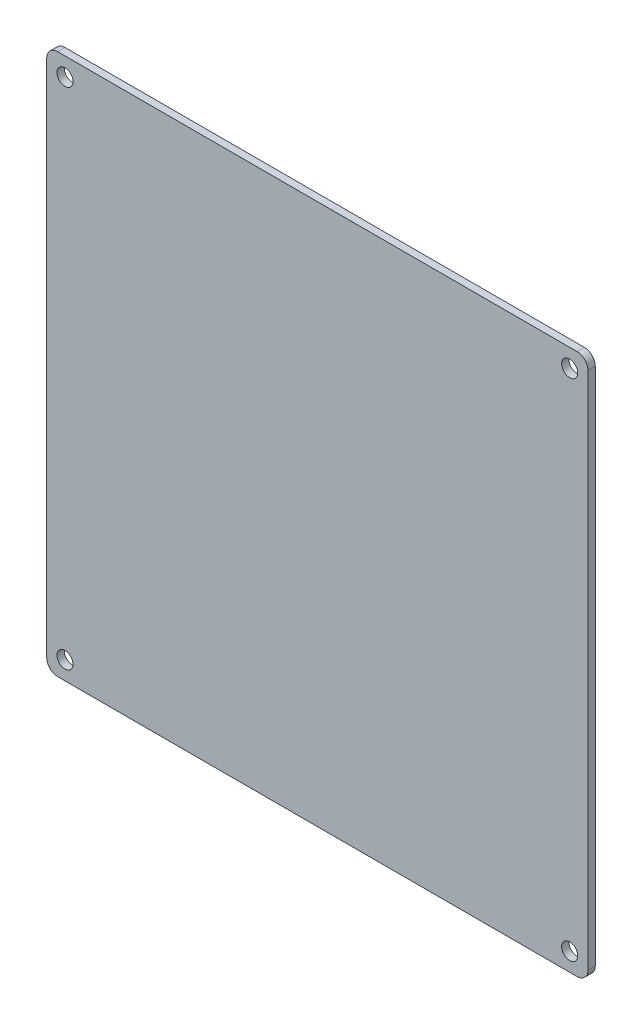
ISO-10303-21;
HEADER;
FILE_DESCRIPTION(('STEP AP214'),'2;1');
FILE_NAME('part.step','',(''),(''),'','','');
FILE_SCHEMA(('AUTOMOTIVE_DESIGN { 1 0 10303 214 1 1 1 1 }'));
ENDSEC;
DATA;
#1=APPLICATION_CONTEXT('core data for automotive mechanical design processes');
#2=APPLICATION_PROTOCOL_DEFINITION('international standard','automotive_design',2000,#1);
#3=PRODUCT_CONTEXT('',#1,'mechanical');
#4=PRODUCT('Part','Part','',(#3));
#5=PRODUCT_RELATED_PRODUCT_CATEGORY('part','',(#4));
#6=PRODUCT_DEFINITION_FORMATION('','',#4);
#7=PRODUCT_DEFINITION_CONTEXT('part definition',#1,'design');
#8=PRODUCT_DEFINITION('design','',#6,#7);
#9=PRODUCT_DEFINITION_SHAPE('','',#8);
#10=(LENGTH_UNIT() NAMED_UNIT(*) SI_UNIT(.MILLI.,.METRE.));
#11=(NAMED_UNIT(*) PLANE_ANGLE_UNIT() SI_UNIT($,.RADIAN.));
#12=(NAMED_UNIT(*) SI_UNIT($,.STERADIAN.) SOLID_ANGLE_UNIT());
#13=UNCERTAINTY_MEASURE_WITH_UNIT(LENGTH_MEASURE(1.E-05),#10,'distance_accuracy_value','');
#14=(GEOMETRIC_REPRESENTATION_CONTEXT(3) GLOBAL_UNCERTAINTY_ASSIGNED_CONTEXT((#13)) GLOBAL_UNIT_ASSIGNED_CONTEXT((#10,
#11,#12)) REPRESENTATION_CONTEXT('',''));
#15=CARTESIAN_POINT('',(0.,0.,0.));
#16=DIRECTION('',(0.,0.,1.));
#17=DIRECTION('',(1.,0.,0.));
#18=AXIS2_PLACEMENT_3D('',#15,#16,#17);
#19=CARTESIAN_POINT('',(0.,0.,1.));
#20=DIRECTION('',(0.,0.,-1.));
#21=DIRECTION('',(-1.,0.,0.));
#22=AXIS2_PLACEMENT_3D('',#19,#20,#21);
#23=PLANE('',#22);
#24=DIRECTION('',(0.,-1.,0.));
#25=VECTOR('',#24,1.);
#26=CARTESIAN_POINT('',(-37.,-37.,1.));
#27=LINE('',#26,#25);
#28=CARTESIAN_POINT('',(-37.,35.5,1.));
#29=VERTEX_POINT('',#28);
#30=CARTESIAN_POINT('',(-37.,-35.5,1.));
#31=VERTEX_POINT('',#30);
#32=EDGE_CURVE('E187',#29,#31,#27,.T.);
#33=ORIENTED_EDGE('',*,*,#32,.T.);
#34=CARTESIAN_POINT('',(-35.5,-35.5,1.));
#35=DIRECTION('',(0.,0.,-1.));
#36=DIRECTION('',(-1.,0.,0.));
#37=AXIS2_PLACEMENT_3D('',#34,#35,#36);
#38=CIRCLE('',#37,1.5);
#39=CARTESIAN_POINT('',(-35.5,-37.,1.));
#40=VERTEX_POINT('',#39);
#41=EDGE_CURVE('E175',#31,#40,#38,.F.);
#42=ORIENTED_EDGE('',*,*,#41,.T.);
#43=DIRECTION('',(1.,0.,0.));
#44=VECTOR('',#43,1.);
#45=CARTESIAN_POINT('',(-37.,-37.,1.));
#46=LINE('',#45,#44);
#47=CARTESIAN_POINT('',(35.5,-37.,1.));
#48=VERTEX_POINT('',#47);
#49=EDGE_CURVE('E133',#40,#48,#46,.T.);
#50=ORIENTED_EDGE('',*,*,#49,.T.);
#51=CARTESIAN_POINT('',(35.5,-35.5,1.));
#52=DIRECTION('',(0.,0.,-1.));
#53=DIRECTION('',(-1.,0.,0.));
#54=AXIS2_PLACEMENT_3D('',#51,#52,#53);
#55=CIRCLE('',#54,1.5);
#56=CARTESIAN_POINT('',(37.,-35.5,1.));
#57=VERTEX_POINT('',#56);
#58=EDGE_CURVE('E172',#48,#57,#55,.F.);
#59=ORIENTED_EDGE('',*,*,#58,.T.);
#60=DIRECTION('',(0.,1.,0.));
#61=VECTOR('',#60,1.);
#62=CARTESIAN_POINT('',(37.,-37.,1.));
#63=LINE('',#62,#61);
#64=CARTESIAN_POINT('',(37.,35.5,1.));
#65=VERTEX_POINT('',#64);
#66=EDGE_CURVE('E142',#57,#65,#63,.T.);
#67=ORIENTED_EDGE('',*,*,#66,.T.);
#68=CARTESIAN_POINT('',(35.5,35.5,1.));
#69=DIRECTION('',(0.,0.,-1.));
#70=DIRECTION('',(-1.,0.,0.));
#71=AXIS2_PLACEMENT_3D('',#68,#69,#70);
#72=CIRCLE('',#71,1.5);
#73=CARTESIAN_POINT('',(35.5,37.,1.));
#74=VERTEX_POINT('',#73);
#75=EDGE_CURVE('E67',#65,#74,#72,.F.);
#76=ORIENTED_EDGE('',*,*,#75,.T.);
#77=DIRECTION('',(-1.,0.,0.));
#78=VECTOR('',#77,1.);
#79=CARTESIAN_POINT('',(-37.,37.,1.));
#80=LINE('',#79,#78);
#81=CARTESIAN_POINT('',(-35.5,37.,1.));
#82=VERTEX_POINT('',#81);
#83=EDGE_CURVE('E147',#74,#82,#80,.T.);
#84=ORIENTED_EDGE('',*,*,#83,.T.);
#85=CARTESIAN_POINT('',(-35.5,35.5,1.));
#86=DIRECTION('',(0.,0.,-1.));
#87=DIRECTION('',(-1.,0.,0.));
#88=AXIS2_PLACEMENT_3D('',#85,#86,#87);
#89=CIRCLE('',#88,1.5);
#90=EDGE_CURVE('E167',#82,#29,#89,.F.);
#91=ORIENTED_EDGE('',*,*,#90,.T.);
#92=EDGE_LOOP('',(#33,#42,#50,#59,#67,#76,#84,#91));
#93=FACE_BOUND('',#92,.T.);
#94=CARTESIAN_POINT('',(-34.5,34.5,1.));
#95=DIRECTION('',(0.,0.,1.));
#96=DIRECTION('',(1.,0.,0.));
#97=AXIS2_PLACEMENT_3D('',#94,#95,#96);
#98=CIRCLE('',#97,1.1);
#99=CARTESIAN_POINT('',(-33.4,34.5,1.));
#100=VERTEX_POINT('',#99);
#101=EDGE_CURVE('E199',#100,#100,#98,.T.);
#102=ORIENTED_EDGE('',*,*,#101,.F.);
#103=EDGE_LOOP('',(#102));
#104=FACE_BOUND('',#103,.T.);
#105=CARTESIAN_POINT('',(34.5,34.5,1.));
#106=DIRECTION('',(0.,0.,1.));
#107=DIRECTION('',(1.,0.,0.));
#108=AXIS2_PLACEMENT_3D('',#105,#106,#107);
#109=CIRCLE('',#108,1.1);
#110=CARTESIAN_POINT('',(35.6,34.5,1.));
#111=VERTEX_POINT('',#110);
#112=EDGE_CURVE('E269',#111,#111,#109,.T.);
#113=ORIENTED_EDGE('',*,*,#112,.F.);
#114=EDGE_LOOP('',(#113));
#115=FACE_BOUND('',#114,.T.);
#116=CARTESIAN_POINT('',(34.5,-34.5,1.));
#117=DIRECTION('',(0.,0.,1.));
#118=DIRECTION('',(1.,0.,0.));
#119=AXIS2_PLACEMENT_3D('',#116,#117,#118);
#120=CIRCLE('',#119,1.1);
#121=CARTESIAN_POINT('',(35.6,-34.5,1.));
#122=VERTEX_POINT('',#121);
#123=EDGE_CURVE('E261',#122,#122,#120,.T.);
#124=ORIENTED_EDGE('',*,*,#123,.F.);
#125=EDGE_LOOP('',(#124));
#126=FACE_BOUND('',#125,.T.);
#127=CARTESIAN_POINT('',(-34.5,-34.5,1.));
#128=DIRECTION('',(0.,0.,1.));
#129=DIRECTION('',(1.,0.,0.));
#130=AXIS2_PLACEMENT_3D('',#127,#128,#129);
#131=CIRCLE('',#130,1.1);
#132=CARTESIAN_POINT('',(-33.4,-34.5,1.));
#133=VERTEX_POINT('',#132);
#134=EDGE_CURVE('E250',#133,#133,#131,.T.);
#135=ORIENTED_EDGE('',*,*,#134,.F.);
#136=EDGE_LOOP('',(#135));
#137=FACE_BOUND('',#136,.T.);
#138=ADVANCED_FACE('F45',(#93,#104,#115,#126,#137),#23,.F.);
#139=CARTESIAN_POINT('',(0.,0.,0.));
#140=DIRECTION('',(0.,0.,-1.));
#141=DIRECTION('',(-1.,0.,0.));
#142=AXIS2_PLACEMENT_3D('',#139,#140,#141);
#143=PLANE('',#142);
#144=CARTESIAN_POINT('',(34.5,-34.5,0.));
#145=DIRECTION('',(0.,0.,1.));
#146=DIRECTION('',(1.,0.,0.));
#147=AXIS2_PLACEMENT_3D('',#144,#145,#146);
#148=CIRCLE('',#147,1.1);
#149=CARTESIAN_POINT('',(35.6,-34.5,0.));
#150=VERTEX_POINT('',#149);
#151=EDGE_CURVE('E258',#150,#150,#148,.T.);
#152=ORIENTED_EDGE('',*,*,#151,.T.);
#153=EDGE_LOOP('',(#152));
#154=FACE_BOUND('',#153,.T.);
#155=CARTESIAN_POINT('',(-34.5,34.5,0.));
#156=DIRECTION('',(0.,0.,1.));
#157=DIRECTION('',(1.,0.,0.));
#158=AXIS2_PLACEMENT_3D('',#155,#156,#157);
#159=CIRCLE('',#158,1.1);
#160=CARTESIAN_POINT('',(-33.4,34.5,0.));
#161=VERTEX_POINT('',#160);
#162=EDGE_CURVE('E273',#161,#161,#159,.T.);
#163=ORIENTED_EDGE('',*,*,#162,.T.);
#164=EDGE_LOOP('',(#163));
#165=FACE_BOUND('',#164,.T.);
#166=DIRECTION('',(1.,0.,0.));
#167=VECTOR('',#166,1.);
#168=CARTESIAN_POINT('',(-37.,-37.,0.));
#169=LINE('',#168,#167);
#170=CARTESIAN_POINT('',(-35.5,-37.,0.));
#171=VERTEX_POINT('',#170);
#172=CARTESIAN_POINT('',(35.5,-37.,0.));
#173=VERTEX_POINT('',#172);
#174=EDGE_CURVE('E130',#171,#173,#169,.T.);
#175=ORIENTED_EDGE('',*,*,#174,.F.);
#176=CARTESIAN_POINT('',(-35.5,-35.5,0.));
#177=DIRECTION('',(0.,0.,-1.));
#178=DIRECTION('',(-1.,0.,0.));
#179=AXIS2_PLACEMENT_3D('',#176,#177,#178);
#180=CIRCLE('',#179,1.5);
#181=CARTESIAN_POINT('',(-37.,-35.5,0.));
#182=VERTEX_POINT('',#181);
#183=EDGE_CURVE('E112',#171,#182,#180,.T.);
#184=ORIENTED_EDGE('',*,*,#183,.T.);
#185=DIRECTION('',(0.,-1.,0.));
#186=VECTOR('',#185,1.);
#187=CARTESIAN_POINT('',(-37.,-37.,0.));
#188=LINE('',#187,#186);
#189=CARTESIAN_POINT('',(-37.,35.5,0.));
#190=VERTEX_POINT('',#189);
#191=EDGE_CURVE('E143',#190,#182,#188,.T.);
#192=ORIENTED_EDGE('',*,*,#191,.F.);
#193=CARTESIAN_POINT('',(-35.5,35.5,0.));
#194=DIRECTION('',(0.,0.,-1.));
#195=DIRECTION('',(-1.,0.,0.));
#196=AXIS2_PLACEMENT_3D('',#193,#194,#195);
#197=CIRCLE('',#196,1.5);
#198=CARTESIAN_POINT('',(-35.5,37.,0.));
#199=VERTEX_POINT('',#198);
#200=EDGE_CURVE('E135',#190,#199,#197,.T.);
#201=ORIENTED_EDGE('',*,*,#200,.T.);
#202=DIRECTION('',(-1.,0.,0.));
#203=VECTOR('',#202,1.);
#204=CARTESIAN_POINT('',(-37.,37.,0.));
#205=LINE('',#204,#203);
#206=CARTESIAN_POINT('',(35.5,37.,0.));
#207=VERTEX_POINT('',#206);
#208=EDGE_CURVE('E149',#207,#199,#205,.T.);
#209=ORIENTED_EDGE('',*,*,#208,.F.);
#210=CARTESIAN_POINT('',(35.5,35.5,0.));
#211=DIRECTION('',(0.,0.,-1.));
#212=DIRECTION('',(-1.,0.,0.));
#213=AXIS2_PLACEMENT_3D('',#210,#211,#212);
#214=CIRCLE('',#213,1.5);
#215=CARTESIAN_POINT('',(37.,35.5,0.));
#216=VERTEX_POINT('',#215);
#217=EDGE_CURVE('E157',#207,#216,#214,.T.);
#218=ORIENTED_EDGE('',*,*,#217,.T.);
#219=DIRECTION('',(0.,1.,0.));
#220=VECTOR('',#219,1.);
#221=CARTESIAN_POINT('',(37.,-37.,0.));
#222=LINE('',#221,#220);
#223=CARTESIAN_POINT('',(37.,-35.5,0.));
#224=VERTEX_POINT('',#223);
#225=EDGE_CURVE('E196',#224,#216,#222,.T.);
#226=ORIENTED_EDGE('',*,*,#225,.F.);
#227=CARTESIAN_POINT('',(35.5,-35.5,0.));
#228=DIRECTION('',(0.,0.,-1.));
#229=DIRECTION('',(-1.,0.,0.));
#230=AXIS2_PLACEMENT_3D('',#227,#228,#229);
#231=CIRCLE('',#230,1.5);
#232=EDGE_CURVE('E124',#224,#173,#231,.T.);
#233=ORIENTED_EDGE('',*,*,#232,.T.);
#234=EDGE_LOOP('',(#175,#184,#192,#201,#209,#218,#226,#233));
#235=FACE_BOUND('',#234,.T.);
#236=CARTESIAN_POINT('',(34.5,34.5,0.));
#237=DIRECTION('',(0.,0.,1.));
#238=DIRECTION('',(1.,0.,0.));
#239=AXIS2_PLACEMENT_3D('',#236,#237,#238);
#240=CIRCLE('',#239,1.1);
#241=CARTESIAN_POINT('',(35.6,34.5,0.));
#242=VERTEX_POINT('',#241);
#243=EDGE_CURVE('E265',#242,#242,#240,.T.);
#244=ORIENTED_EDGE('',*,*,#243,.T.);
#245=EDGE_LOOP('',(#244));
#246=FACE_BOUND('',#245,.T.);
#247=CARTESIAN_POINT('',(-34.5,-34.5,0.));
#248=DIRECTION('',(0.,0.,1.));
#249=DIRECTION('',(1.,0.,0.));
#250=AXIS2_PLACEMENT_3D('',#247,#248,#249);
#251=CIRCLE('',#250,1.1);
#252=CARTESIAN_POINT('',(-33.4,-34.5,0.));
#253=VERTEX_POINT('',#252);
#254=EDGE_CURVE('E253',#253,#253,#251,.T.);
#255=ORIENTED_EDGE('',*,*,#254,.T.);
#256=EDGE_LOOP('',(#255));
#257=FACE_BOUND('',#256,.T.);
#258=ADVANCED_FACE('F138',(#154,#165,#235,#246,#257),#143,.T.);
#259=CARTESIAN_POINT('',(37.,-37.,1.));
#260=DIRECTION('',(-1.,0.,0.));
#261=DIRECTION('',(0.,0.,1.));
#262=AXIS2_PLACEMENT_3D('',#259,#260,#261);
#263=PLANE('',#262);
#264=ORIENTED_EDGE('',*,*,#66,.F.);
#265=DIRECTION('',(0.,0.,-1.));
#266=VECTOR('',#265,1.);
#267=CARTESIAN_POINT('',(37.,-35.5,1.));
#268=LINE('',#267,#266);
#269=EDGE_CURVE('E181',#57,#224,#268,.T.);
#270=ORIENTED_EDGE('',*,*,#269,.T.);
#271=ORIENTED_EDGE('',*,*,#225,.T.);
#272=DIRECTION('',(0.,0.,-1.));
#273=VECTOR('',#272,1.);
#274=CARTESIAN_POINT('',(37.,35.5,1.));
#275=LINE('',#274,#273);
#276=EDGE_CURVE('E178',#216,#65,#275,.F.);
#277=ORIENTED_EDGE('',*,*,#276,.T.);
#278=EDGE_LOOP('',(#264,#270,#271,#277));
#279=FACE_BOUND('',#278,.T.);
#280=ADVANCED_FACE('F218',(#279),#263,.F.);
#281=CARTESIAN_POINT('',(-37.,37.,1.));
#282=DIRECTION('',(0.,-1.,0.));
#283=DIRECTION('',(0.,0.,-1.));
#284=AXIS2_PLACEMENT_3D('',#281,#282,#283);
#285=PLANE('',#284);
#286=ORIENTED_EDGE('',*,*,#83,.F.);
#287=DIRECTION('',(0.,0.,-1.));
#288=VECTOR('',#287,1.);
#289=CARTESIAN_POINT('',(35.5,37.,1.));
#290=LINE('',#289,#288);
#291=EDGE_CURVE('E11',#74,#207,#290,.T.);
#292=ORIENTED_EDGE('',*,*,#291,.T.);
#293=ORIENTED_EDGE('',*,*,#208,.T.);
#294=DIRECTION('',(0.,0.,-1.));
#295=VECTOR('',#294,1.);
#296=CARTESIAN_POINT('',(-35.5,37.,1.));
#297=LINE('',#296,#295);
#298=EDGE_CURVE('E54',#199,#82,#297,.F.);
#299=ORIENTED_EDGE('',*,*,#298,.T.);
#300=EDGE_LOOP('',(#286,#292,#293,#299));
#301=FACE_BOUND('',#300,.T.);
#302=ADVANCED_FACE('F202',(#301),#285,.F.);
#303=CARTESIAN_POINT('',(-37.,-37.,1.));
#304=DIRECTION('',(1.,0.,0.));
#305=DIRECTION('',(0.,0.,-1.));
#306=AXIS2_PLACEMENT_3D('',#303,#304,#305);
#307=PLANE('',#306);
#308=ORIENTED_EDGE('',*,*,#191,.T.);
#309=DIRECTION('',(0.,0.,-1.));
#310=VECTOR('',#309,1.);
#311=CARTESIAN_POINT('',(-37.,-35.5,1.));
#312=LINE('',#311,#310);
#313=EDGE_CURVE('E117',#182,#31,#312,.F.);
#314=ORIENTED_EDGE('',*,*,#313,.T.);
#315=ORIENTED_EDGE('',*,*,#32,.F.);
#316=DIRECTION('',(0.,0.,-1.));
#317=VECTOR('',#316,1.);
#318=CARTESIAN_POINT('',(-37.,35.5,1.));
#319=LINE('',#318,#317);
#320=EDGE_CURVE('E123',#29,#190,#319,.T.);
#321=ORIENTED_EDGE('',*,*,#320,.T.);
#322=EDGE_LOOP('',(#308,#314,#315,#321));
#323=FACE_BOUND('',#322,.T.);
#324=ADVANCED_FACE('F209',(#323),#307,.F.);
#325=CARTESIAN_POINT('',(-37.,-37.,1.));
#326=DIRECTION('',(0.,1.,0.));
#327=DIRECTION('',(0.,0.,1.));
#328=AXIS2_PLACEMENT_3D('',#325,#326,#327);
#329=PLANE('',#328);
#330=ORIENTED_EDGE('',*,*,#49,.F.);
#331=DIRECTION('',(0.,0.,-1.));
#332=VECTOR('',#331,1.);
#333=CARTESIAN_POINT('',(-35.5,-37.,1.));
#334=LINE('',#333,#332);
#335=EDGE_CURVE('E116',#40,#171,#334,.T.);
#336=ORIENTED_EDGE('',*,*,#335,.T.);
#337=ORIENTED_EDGE('',*,*,#174,.T.);
#338=DIRECTION('',(0.,0.,-1.));
#339=VECTOR('',#338,1.);
#340=CARTESIAN_POINT('',(35.5,-37.,1.));
#341=LINE('',#340,#339);
#342=EDGE_CURVE('E136',#173,#48,#341,.F.);
#343=ORIENTED_EDGE('',*,*,#342,.T.);
#344=EDGE_LOOP('',(#330,#336,#337,#343));
#345=FACE_BOUND('',#344,.T.);
#346=ADVANCED_FACE('F129',(#345),#329,.F.);
#347=CARTESIAN_POINT('',(-34.5,34.5,1.));
#348=DIRECTION('',(0.,0.,-1.));
#349=DIRECTION('',(-1.,0.,0.));
#350=AXIS2_PLACEMENT_3D('',#347,#348,#349);
#351=CYLINDRICAL_SURFACE('',#350,1.1);
#352=ORIENTED_EDGE('',*,*,#101,.T.);
#353=EDGE_LOOP('',(#352));
#354=FACE_BOUND('',#353,.T.);
#355=ORIENTED_EDGE('',*,*,#162,.F.);
#356=EDGE_LOOP('',(#355));
#357=FACE_BOUND('',#356,.T.);
#358=ADVANCED_FACE('F216',(#354,#357),#351,.F.);
#359=CARTESIAN_POINT('',(34.5,34.5,1.));
#360=DIRECTION('',(0.,0.,-1.));
#361=DIRECTION('',(-1.,0.,0.));
#362=AXIS2_PLACEMENT_3D('',#359,#360,#361);
#363=CYLINDRICAL_SURFACE('',#362,1.1);
#364=ORIENTED_EDGE('',*,*,#112,.T.);
#365=EDGE_LOOP('',(#364));
#366=FACE_BOUND('',#365,.T.);
#367=ORIENTED_EDGE('',*,*,#243,.F.);
#368=EDGE_LOOP('',(#367));
#369=FACE_BOUND('',#368,.T.);
#370=ADVANCED_FACE('F230',(#366,#369),#363,.F.);
#371=CARTESIAN_POINT('',(34.5,-34.5,1.));
#372=DIRECTION('',(0.,0.,-1.));
#373=DIRECTION('',(-1.,0.,0.));
#374=AXIS2_PLACEMENT_3D('',#371,#372,#373);
#375=CYLINDRICAL_SURFACE('',#374,1.1);
#376=ORIENTED_EDGE('',*,*,#123,.T.);
#377=EDGE_LOOP('',(#376));
#378=FACE_BOUND('',#377,.T.);
#379=ORIENTED_EDGE('',*,*,#151,.F.);
#380=EDGE_LOOP('',(#379));
#381=FACE_BOUND('',#380,.T.);
#382=ADVANCED_FACE('F234',(#378,#381),#375,.F.);
#383=CARTESIAN_POINT('',(-34.5,-34.5,1.));
#384=DIRECTION('',(0.,0.,-1.));
#385=DIRECTION('',(-1.,0.,0.));
#386=AXIS2_PLACEMENT_3D('',#383,#384,#385);
#387=CYLINDRICAL_SURFACE('',#386,1.1);
#388=ORIENTED_EDGE('',*,*,#134,.T.);
#389=EDGE_LOOP('',(#388));
#390=FACE_BOUND('',#389,.T.);
#391=ORIENTED_EDGE('',*,*,#254,.F.);
#392=EDGE_LOOP('',(#391));
#393=FACE_BOUND('',#392,.T.);
#394=ADVANCED_FACE('F238',(#390,#393),#387,.F.);
#395=CARTESIAN_POINT('',(-35.5,-35.5,1.));
#396=DIRECTION('',(0.,0.,-1.));
#397=DIRECTION('',(-1.,0.,0.));
#398=AXIS2_PLACEMENT_3D('',#395,#396,#397);
#399=CYLINDRICAL_SURFACE('',#398,1.5);
#400=ORIENTED_EDGE('',*,*,#41,.F.);
#401=ORIENTED_EDGE('',*,*,#313,.F.);
#402=ORIENTED_EDGE('',*,*,#183,.F.);
#403=ORIENTED_EDGE('',*,*,#335,.F.);
#404=EDGE_LOOP('',(#400,#401,#402,#403));
#405=FACE_BOUND('',#404,.T.);
#406=ADVANCED_FACE('F115',(#405),#399,.T.);
#407=CARTESIAN_POINT('',(35.5,-35.5,1.));
#408=DIRECTION('',(0.,0.,-1.));
#409=DIRECTION('',(-1.,0.,0.));
#410=AXIS2_PLACEMENT_3D('',#407,#408,#409);
#411=CYLINDRICAL_SURFACE('',#410,1.5);
#412=ORIENTED_EDGE('',*,*,#58,.F.);
#413=ORIENTED_EDGE('',*,*,#342,.F.);
#414=ORIENTED_EDGE('',*,*,#232,.F.);
#415=ORIENTED_EDGE('',*,*,#269,.F.);
#416=EDGE_LOOP('',(#412,#413,#414,#415));
#417=FACE_BOUND('',#416,.T.);
#418=ADVANCED_FACE('F245',(#417),#411,.T.);
#419=CARTESIAN_POINT('',(35.5,35.5,1.));
#420=DIRECTION('',(0.,0.,-1.));
#421=DIRECTION('',(-1.,0.,0.));
#422=AXIS2_PLACEMENT_3D('',#419,#420,#421);
#423=CYLINDRICAL_SURFACE('',#422,1.5);
#424=ORIENTED_EDGE('',*,*,#75,.F.);
#425=ORIENTED_EDGE('',*,*,#276,.F.);
#426=ORIENTED_EDGE('',*,*,#217,.F.);
#427=ORIENTED_EDGE('',*,*,#291,.F.);
#428=EDGE_LOOP('',(#424,#425,#426,#427));
#429=FACE_BOUND('',#428,.T.);
#430=ADVANCED_FACE('F297',(#429),#423,.T.);
#431=CARTESIAN_POINT('',(-35.5,35.5,1.));
#432=DIRECTION('',(0.,0.,-1.));
#433=DIRECTION('',(-1.,0.,0.));
#434=AXIS2_PLACEMENT_3D('',#431,#432,#433);
#435=CYLINDRICAL_SURFACE('',#434,1.5);
#436=ORIENTED_EDGE('',*,*,#90,.F.);
#437=ORIENTED_EDGE('',*,*,#298,.F.);
#438=ORIENTED_EDGE('',*,*,#200,.F.);
#439=ORIENTED_EDGE('',*,*,#320,.F.);
#440=EDGE_LOOP('',(#436,#437,#438,#439));
#441=FACE_BOUND('',#440,.T.);
#442=ADVANCED_FACE('F47',(#441),#435,.T.);
#443=CLOSED_SHELL('',(#138,#258,#280,#302,#324,#346,#358,#370,#382,#394,#406,#418,#430,#442));
#444=MANIFOLD_SOLID_BREP('B2',#443);
#445=ADVANCED_BREP_SHAPE_REPRESENTATION('',(#18,#444),#14);
#446=SHAPE_DEFINITION_REPRESENTATION(#9,#445);
ENDSEC;
END-ISO-10303-21;
